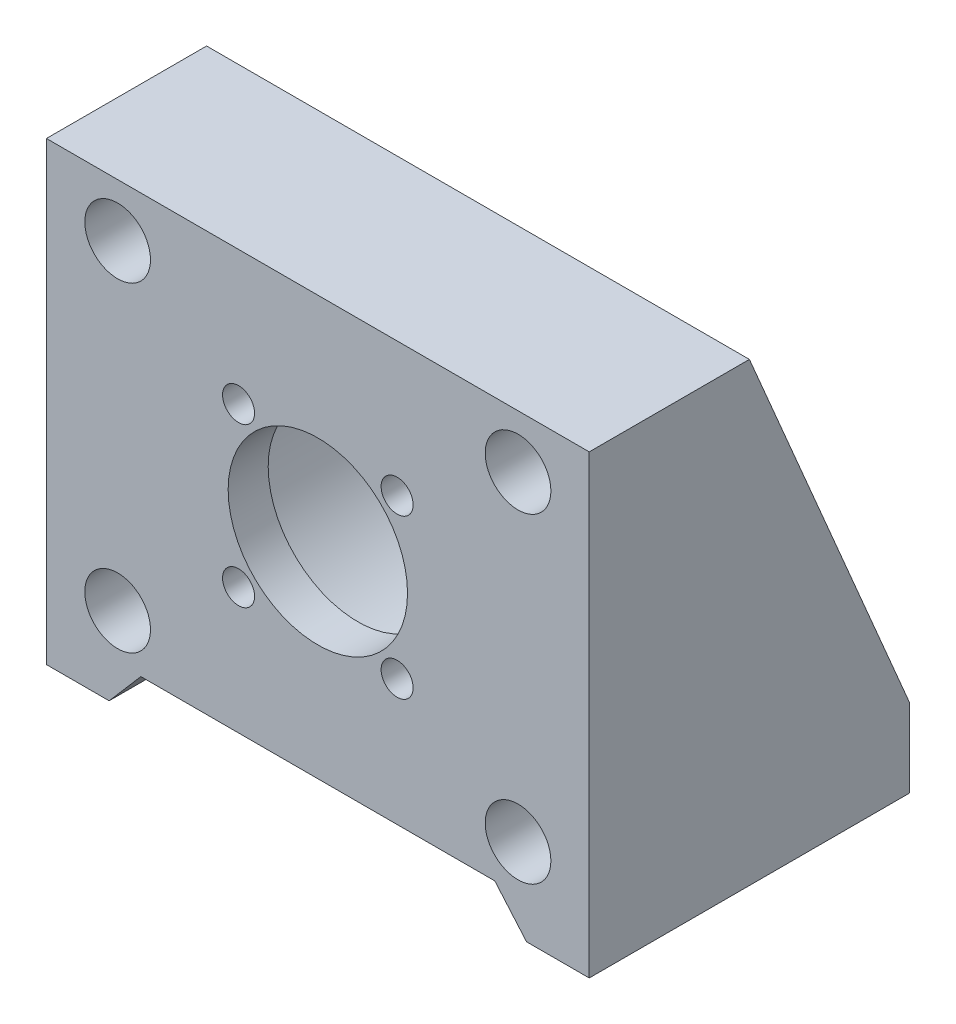
ISO-10303-21;
HEADER;
FILE_DESCRIPTION(('STEP AP214'),'2;1');
FILE_NAME('part.step','',(''),(''),'','','');
FILE_SCHEMA(('AUTOMOTIVE_DESIGN { 1 0 10303 214 1 1 1 1 }'));
ENDSEC;
DATA;
#1=APPLICATION_CONTEXT('core data for automotive mechanical design processes');
#2=APPLICATION_PROTOCOL_DEFINITION('international standard','automotive_design',2000,#1);
#3=PRODUCT_CONTEXT('',#1,'mechanical');
#4=PRODUCT('Part','Part','',(#3));
#5=PRODUCT_RELATED_PRODUCT_CATEGORY('part','',(#4));
#6=PRODUCT_DEFINITION_FORMATION('','',#4);
#7=PRODUCT_DEFINITION_CONTEXT('part definition',#1,'design');
#8=PRODUCT_DEFINITION('design','',#6,#7);
#9=PRODUCT_DEFINITION_SHAPE('','',#8);
#10=(LENGTH_UNIT() NAMED_UNIT(*) SI_UNIT(.MILLI.,.METRE.));
#11=(NAMED_UNIT(*) PLANE_ANGLE_UNIT() SI_UNIT($,.RADIAN.));
#12=(NAMED_UNIT(*) SI_UNIT($,.STERADIAN.) SOLID_ANGLE_UNIT());
#13=UNCERTAINTY_MEASURE_WITH_UNIT(LENGTH_MEASURE(1.E-05),#10,'distance_accuracy_value','');
#14=(GEOMETRIC_REPRESENTATION_CONTEXT(3) GLOBAL_UNCERTAINTY_ASSIGNED_CONTEXT((#13)) GLOBAL_UNIT_ASSIGNED_CONTEXT((#10,
#11,#12)) REPRESENTATION_CONTEXT('',''));
#15=CARTESIAN_POINT('',(0.,0.,0.));
#16=DIRECTION('',(0.,0.,1.));
#17=DIRECTION('',(1.,0.,0.));
#18=AXIS2_PLACEMENT_3D('',#15,#16,#17);
#19=CARTESIAN_POINT('',(0.,0.,5.));
#20=DIRECTION('',(0.,0.,-1.));
#21=DIRECTION('',(-1.,0.,0.));
#22=AXIS2_PLACEMENT_3D('',#19,#20,#21);
#23=PLANE('',#22);
#24=CARTESIAN_POINT('',(25.,-20.,5.));
#25=DIRECTION('',(0.,0.,1.));
#26=DIRECTION('',(1.,0.,0.));
#27=AXIS2_PLACEMENT_3D('',#24,#25,#26);
#28=CIRCLE('',#27,4.10000000000001);
#29=CARTESIAN_POINT('',(29.1,-20.,5.));
#30=VERTEX_POINT('',#29);
#31=EDGE_CURVE('E230',#30,#30,#28,.T.);
#32=ORIENTED_EDGE('',*,*,#31,.F.);
#33=EDGE_LOOP('',(#32));
#34=FACE_BOUND('',#33,.T.);
#35=CARTESIAN_POINT('',(25.,20.,5.));
#36=DIRECTION('',(0.,0.,1.));
#37=DIRECTION('',(1.,0.,0.));
#38=AXIS2_PLACEMENT_3D('',#35,#36,#37);
#39=CIRCLE('',#38,4.10000000000001);
#40=CARTESIAN_POINT('',(29.1,20.,5.));
#41=VERTEX_POINT('',#40);
#42=EDGE_CURVE('E224',#41,#41,#39,.T.);
#43=ORIENTED_EDGE('',*,*,#42,.F.);
#44=EDGE_LOOP('',(#43));
#45=FACE_BOUND('',#44,.T.);
#46=CARTESIAN_POINT('',(-25.,20.,5.));
#47=DIRECTION('',(0.,0.,1.));
#48=DIRECTION('',(1.,0.,0.));
#49=AXIS2_PLACEMENT_3D('',#46,#47,#48);
#50=CIRCLE('',#49,4.10000000000001);
#51=CARTESIAN_POINT('',(-20.9,20.,5.));
#52=VERTEX_POINT('',#51);
#53=EDGE_CURVE('E218',#52,#52,#50,.T.);
#54=ORIENTED_EDGE('',*,*,#53,.F.);
#55=EDGE_LOOP('',(#54));
#56=FACE_BOUND('',#55,.T.);
#57=CARTESIAN_POINT('',(-25.,-20.,5.));
#58=DIRECTION('',(0.,0.,1.));
#59=DIRECTION('',(1.,0.,0.));
#60=AXIS2_PLACEMENT_3D('',#57,#58,#59);
#61=CIRCLE('',#60,4.10000000000001);
#62=CARTESIAN_POINT('',(-20.9,-20.,5.));
#63=VERTEX_POINT('',#62);
#64=EDGE_CURVE('E209',#63,#63,#61,.T.);
#65=ORIENTED_EDGE('',*,*,#64,.F.);
#66=EDGE_LOOP('',(#65));
#67=FACE_BOUND('',#66,.T.);
#68=CARTESIAN_POINT('',(0.,0.,5.));
#69=DIRECTION('',(0.,0.,-1.));
#70=DIRECTION('',(-1.,0.,0.));
#71=AXIS2_PLACEMENT_3D('',#68,#69,#70);
#72=CIRCLE('',#71,11.2);
#73=CARTESIAN_POINT('',(-11.1999999999999,0.,5.));
#74=VERTEX_POINT('',#73);
#75=EDGE_CURVE('E155',#74,#74,#72,.T.);
#76=ORIENTED_EDGE('',*,*,#75,.T.);
#77=EDGE_LOOP('',(#76));
#78=FACE_BOUND('',#77,.T.);
#79=DIRECTION('',(-1.,0.,0.));
#80=VECTOR('',#79,1.);
#81=CARTESIAN_POINT('',(33.8909125624696,26.6303358280027,5.));
#82=LINE('',#81,#80);
#83=CARTESIAN_POINT('',(33.8909125624696,26.6303358280027,5.));
#84=VERTEX_POINT('',#83);
#85=CARTESIAN_POINT('',(-33.8909125624696,26.6303358280027,5.));
#86=VERTEX_POINT('',#85);
#87=EDGE_CURVE('E166',#84,#86,#82,.T.);
#88=ORIENTED_EDGE('',*,*,#87,.T.);
#89=DIRECTION('',(0.,1.,0.));
#90=VECTOR('',#89,1.);
#91=CARTESIAN_POINT('',(-33.8909125624696,-30.2693325558892,5.));
#92=LINE('',#91,#90);
#93=CARTESIAN_POINT('',(-33.8909125624696,-30.2693325558892,5.));
#94=VERTEX_POINT('',#93);
#95=EDGE_CURVE('E133',#94,#86,#92,.T.);
#96=ORIENTED_EDGE('',*,*,#95,.F.);
#97=DIRECTION('',(-1.,0.,0.));
#98=VECTOR('',#97,1.);
#99=CARTESIAN_POINT('',(-26.0623199020207,-30.2693325558892,5.));
#100=LINE('',#99,#98);
#101=CARTESIAN_POINT('',(-26.0623199020207,-30.2693325558892,5.));
#102=VERTEX_POINT('',#101);
#103=EDGE_CURVE('E111',#102,#94,#100,.T.);
#104=ORIENTED_EDGE('',*,*,#103,.F.);
#105=DIRECTION('',(-0.652480888733171,-0.757805179342271,0.));
#106=VECTOR('',#105,1.);
#107=CARTESIAN_POINT('',(-22.0994780457318,-25.6668037531824,5.));
#108=LINE('',#107,#106);
#109=CARTESIAN_POINT('',(-22.0994780457318,-25.6668037531824,5.));
#110=VERTEX_POINT('',#109);
#111=EDGE_CURVE('E136',#110,#102,#108,.T.);
#112=ORIENTED_EDGE('',*,*,#111,.F.);
#113=DIRECTION('',(1.,0.,0.));
#114=VECTOR('',#113,1.);
#115=CARTESIAN_POINT('',(0.,-25.6668037531824,5.));
#116=LINE('',#115,#114);
#117=CARTESIAN_POINT('',(22.0994780457318,-25.6668037531824,5.));
#118=VERTEX_POINT('',#117);
#119=EDGE_CURVE('E158',#110,#118,#116,.T.);
#120=ORIENTED_EDGE('',*,*,#119,.T.);
#121=DIRECTION('',(0.652480888733171,-0.757805179342271,0.));
#122=VECTOR('',#121,1.);
#123=CARTESIAN_POINT('',(22.0994780457318,-25.6668037531824,5.));
#124=LINE('',#123,#122);
#125=CARTESIAN_POINT('',(26.0623199020207,-30.2693325558892,5.));
#126=VERTEX_POINT('',#125);
#127=EDGE_CURVE('E160',#118,#126,#124,.T.);
#128=ORIENTED_EDGE('',*,*,#127,.T.);
#129=DIRECTION('',(1.,0.,0.));
#130=VECTOR('',#129,1.);
#131=CARTESIAN_POINT('',(26.0623199020207,-30.2693325558892,5.));
#132=LINE('',#131,#130);
#133=CARTESIAN_POINT('',(33.8909125624696,-30.2693325558892,5.));
#134=VERTEX_POINT('',#133);
#135=EDGE_CURVE('E162',#126,#134,#132,.T.);
#136=ORIENTED_EDGE('',*,*,#135,.T.);
#137=DIRECTION('',(0.,1.,0.));
#138=VECTOR('',#137,1.);
#139=CARTESIAN_POINT('',(33.8909125624696,-30.2693325558892,5.));
#140=LINE('',#139,#138);
#141=EDGE_CURVE('E164',#134,#84,#140,.T.);
#142=ORIENTED_EDGE('',*,*,#141,.T.);
#143=EDGE_LOOP('',(#88,#96,#104,#112,#120,#128,#136,#142));
#144=FACE_BOUND('',#143,.T.);
#145=CARTESIAN_POINT('',(9.89949493661171,9.89949493661162,5.));
#146=DIRECTION('',(0.,0.,1.));
#147=DIRECTION('',(1.,0.,0.));
#148=AXIS2_PLACEMENT_3D('',#145,#146,#147);
#149=CIRCLE('',#148,2.00000000000001);
#150=CARTESIAN_POINT('',(11.8994949366117,9.89949493661162,5.));
#151=VERTEX_POINT('',#150);
#152=EDGE_CURVE('E236',#151,#151,#149,.T.);
#153=ORIENTED_EDGE('',*,*,#152,.F.);
#154=EDGE_LOOP('',(#153));
#155=FACE_BOUND('',#154,.T.);
#156=CARTESIAN_POINT('',(-9.89949493661165,9.89949493661168,5.));
#157=DIRECTION('',(0.,0.,1.));
#158=DIRECTION('',(1.,0.,0.));
#159=AXIS2_PLACEMENT_3D('',#156,#157,#158);
#160=CIRCLE('',#159,2.00000000000001);
#161=CARTESIAN_POINT('',(-7.89949493661164,9.89949493661168,5.));
#162=VERTEX_POINT('',#161);
#163=EDGE_CURVE('E242',#162,#162,#160,.T.);
#164=ORIENTED_EDGE('',*,*,#163,.F.);
#165=EDGE_LOOP('',(#164));
#166=FACE_BOUND('',#165,.T.);
#167=CARTESIAN_POINT('',(-9.89949493661171,-9.89949493661162,5.));
#168=DIRECTION('',(0.,0.,1.));
#169=DIRECTION('',(1.,0.,0.));
#170=AXIS2_PLACEMENT_3D('',#167,#168,#169);
#171=CIRCLE('',#170,2.00000000000001);
#172=CARTESIAN_POINT('',(-7.8994949366117,-9.89949493661162,5.));
#173=VERTEX_POINT('',#172);
#174=EDGE_CURVE('E248',#173,#173,#171,.T.);
#175=ORIENTED_EDGE('',*,*,#174,.F.);
#176=EDGE_LOOP('',(#175));
#177=FACE_BOUND('',#176,.T.);
#178=CARTESIAN_POINT('',(9.89949493661172,-9.89949493661161,5.));
#179=DIRECTION('',(0.,0.,1.));
#180=DIRECTION('',(1.,0.,0.));
#181=AXIS2_PLACEMENT_3D('',#178,#179,#180);
#182=CIRCLE('',#181,2.00000000000001);
#183=CARTESIAN_POINT('',(11.8994949366117,-9.89949493661161,5.));
#184=VERTEX_POINT('',#183);
#185=EDGE_CURVE('E254',#184,#184,#182,.T.);
#186=ORIENTED_EDGE('',*,*,#185,.F.);
#187=EDGE_LOOP('',(#186));
#188=FACE_BOUND('',#187,.T.);
#189=ADVANCED_FACE('F34',(#34,#45,#56,#67,#78,#144,#155,#166,#177,#188),#23,.F.);
#190=CARTESIAN_POINT('',(0.,0.,5.));
#191=DIRECTION('',(0.,0.,-1.));
#192=DIRECTION('',(-1.,0.,0.));
#193=AXIS2_PLACEMENT_3D('',#190,#191,#192);
#194=CYLINDRICAL_SURFACE('',#193,11.2);
#195=CARTESIAN_POINT('',(0.,0.,0.));
#196=DIRECTION('',(0.,0.,1.));
#197=DIRECTION('',(1.,0.,0.));
#198=AXIS2_PLACEMENT_3D('',#195,#196,#197);
#199=CIRCLE('',#198,11.2);
#200=CARTESIAN_POINT('',(11.2000000000001,0.,0.));
#201=VERTEX_POINT('',#200);
#202=EDGE_CURVE('E124',#201,#201,#199,.F.);
#203=ORIENTED_EDGE('',*,*,#202,.T.);
#204=EDGE_LOOP('',(#203));
#205=FACE_BOUND('',#204,.T.);
#206=ORIENTED_EDGE('',*,*,#75,.F.);
#207=EDGE_LOOP('',(#206));
#208=FACE_BOUND('',#207,.T.);
#209=ADVANCED_FACE('F262',(#205,#208),#194,.F.);
#210=CARTESIAN_POINT('',(0.,-25.6668037531824,5.));
#211=DIRECTION('',(0.,1.,0.));
#212=DIRECTION('',(-1.,0.,0.));
#213=AXIS2_PLACEMENT_3D('',#210,#211,#212);
#214=PLANE('',#213);
#215=ORIENTED_EDGE('',*,*,#119,.F.);
#216=DIRECTION('',(0.,0.,-1.));
#217=VECTOR('',#216,1.);
#218=CARTESIAN_POINT('',(-22.0994780457318,-25.6668037531824,5.));
#219=LINE('',#218,#217);
#220=CARTESIAN_POINT('',(-22.0994780457318,-25.6668037531824,-35.));
#221=VERTEX_POINT('',#220);
#222=EDGE_CURVE('E139',#110,#221,#219,.T.);
#223=ORIENTED_EDGE('',*,*,#222,.T.);
#224=DIRECTION('',(1.,0.,0.));
#225=VECTOR('',#224,1.);
#226=CARTESIAN_POINT('',(0.,-25.6668037531824,-35.));
#227=LINE('',#226,#225);
#228=CARTESIAN_POINT('',(22.0994780457318,-25.6668037531824,-35.));
#229=VERTEX_POINT('',#228);
#230=EDGE_CURVE('E144',#221,#229,#227,.T.);
#231=ORIENTED_EDGE('',*,*,#230,.T.);
#232=DIRECTION('',(0.,0.,-1.));
#233=VECTOR('',#232,1.);
#234=CARTESIAN_POINT('',(22.0994780457318,-25.6668037531824,5.));
#235=LINE('',#234,#233);
#236=EDGE_CURVE('E175',#118,#229,#235,.T.);
#237=ORIENTED_EDGE('',*,*,#236,.F.);
#238=EDGE_LOOP('',(#215,#223,#231,#237));
#239=FACE_BOUND('',#238,.T.);
#240=ADVANCED_FACE('F268',(#239),#214,.F.);
#241=CARTESIAN_POINT('',(22.0994780457318,-25.6668037531824,5.));
#242=DIRECTION('',(0.757805179342271,0.652480888733171,0.));
#243=DIRECTION('',(-0.652480888733171,0.757805179342271,0.));
#244=AXIS2_PLACEMENT_3D('',#241,#242,#243);
#245=PLANE('',#244);
#246=ORIENTED_EDGE('',*,*,#236,.T.);
#247=DIRECTION('',(0.652480888733171,-0.757805179342271,0.));
#248=VECTOR('',#247,1.);
#249=CARTESIAN_POINT('',(22.0994780457318,-25.6668037531824,-35.));
#250=LINE('',#249,#248);
#251=CARTESIAN_POINT('',(26.0623199020207,-30.2693325558892,-35.));
#252=VERTEX_POINT('',#251);
#253=EDGE_CURVE('E147',#229,#252,#250,.T.);
#254=ORIENTED_EDGE('',*,*,#253,.T.);
#255=DIRECTION('',(0.,0.,-1.));
#256=VECTOR('',#255,1.);
#257=CARTESIAN_POINT('',(26.0623199020207,-30.2693325558892,5.));
#258=LINE('',#257,#256);
#259=EDGE_CURVE('E173',#126,#252,#258,.T.);
#260=ORIENTED_EDGE('',*,*,#259,.F.);
#261=ORIENTED_EDGE('',*,*,#127,.F.);
#262=EDGE_LOOP('',(#246,#254,#260,#261));
#263=FACE_BOUND('',#262,.T.);
#264=ADVANCED_FACE('F282',(#263),#245,.F.);
#265=CARTESIAN_POINT('',(26.0623199020207,-30.2693325558892,5.));
#266=DIRECTION('',(0.,1.,0.));
#267=DIRECTION('',(0.,0.,1.));
#268=AXIS2_PLACEMENT_3D('',#265,#266,#267);
#269=PLANE('',#268);
#270=ORIENTED_EDGE('',*,*,#259,.T.);
#271=DIRECTION('',(1.,0.,0.));
#272=VECTOR('',#271,1.);
#273=CARTESIAN_POINT('',(26.0623199020207,-30.2693325558892,-35.));
#274=LINE('',#273,#272);
#275=CARTESIAN_POINT('',(33.8909125624696,-30.2693325558892,-35.));
#276=VERTEX_POINT('',#275);
#277=EDGE_CURVE('E150',#252,#276,#274,.T.);
#278=ORIENTED_EDGE('',*,*,#277,.T.);
#279=DIRECTION('',(0.,0.,-1.));
#280=VECTOR('',#279,1.);
#281=CARTESIAN_POINT('',(33.8909125624696,-30.2693325558892,5.));
#282=LINE('',#281,#280);
#283=EDGE_CURVE('E171',#134,#276,#282,.T.);
#284=ORIENTED_EDGE('',*,*,#283,.F.);
#285=ORIENTED_EDGE('',*,*,#135,.F.);
#286=EDGE_LOOP('',(#270,#278,#284,#285));
#287=FACE_BOUND('',#286,.T.);
#288=ADVANCED_FACE('F279',(#287),#269,.F.);
#289=CARTESIAN_POINT('',(33.8909125624696,-30.2693325558892,5.));
#290=DIRECTION('',(-1.,0.,0.));
#291=DIRECTION('',(0.,0.,1.));
#292=AXIS2_PLACEMENT_3D('',#289,#290,#291);
#293=PLANE('',#292);
#294=DIRECTION('',(0.,1.,0.));
#295=VECTOR('',#294,1.);
#296=CARTESIAN_POINT('',(33.8909125624696,-30.2693325558892,-35.));
#297=LINE('',#296,#295);
#298=CARTESIAN_POINT('',(33.8909125624696,-20.4867114884723,-35.));
#299=VERTEX_POINT('',#298);
#300=EDGE_CURVE('E153',#276,#299,#297,.T.);
#301=ORIENTED_EDGE('',*,*,#300,.T.);
#302=DIRECTION('',(0.,0.92050485345244,0.390731128489275));
#303=VECTOR('',#302,1.);
#304=CARTESIAN_POINT('',(33.8909125624696,26.6303358280027,-15.));
#305=LINE('',#304,#303);
#306=CARTESIAN_POINT('',(33.8909125624696,26.6303358280027,-15.));
#307=VERTEX_POINT('',#306);
#308=EDGE_CURVE('E11',#299,#307,#305,.T.);
#309=ORIENTED_EDGE('',*,*,#308,.T.);
#310=DIRECTION('',(0.,0.,-1.));
#311=VECTOR('',#310,1.);
#312=CARTESIAN_POINT('',(33.8909125624696,26.6303358280027,5.));
#313=LINE('',#312,#311);
#314=EDGE_CURVE('E168',#84,#307,#313,.T.);
#315=ORIENTED_EDGE('',*,*,#314,.F.);
#316=ORIENTED_EDGE('',*,*,#141,.F.);
#317=ORIENTED_EDGE('',*,*,#283,.T.);
#318=EDGE_LOOP('',(#301,#309,#315,#316,#317));
#319=FACE_BOUND('',#318,.T.);
#320=ADVANCED_FACE('F196',(#319),#293,.F.);
#321=CARTESIAN_POINT('',(33.8909125624696,26.6303358280027,5.));
#322=DIRECTION('',(0.,-1.,0.));
#323=DIRECTION('',(1.,0.,0.));
#324=AXIS2_PLACEMENT_3D('',#321,#322,#323);
#325=PLANE('',#324);
#326=ORIENTED_EDGE('',*,*,#314,.T.);
#327=DIRECTION('',(-1.,0.,0.));
#328=VECTOR('',#327,1.);
#329=CARTESIAN_POINT('',(-33.8909125624696,26.6303358280027,-15.));
#330=LINE('',#329,#328);
#331=CARTESIAN_POINT('',(-33.8909125624696,26.6303358280027,-15.));
#332=VERTEX_POINT('',#331);
#333=EDGE_CURVE('E176',#307,#332,#330,.T.);
#334=ORIENTED_EDGE('',*,*,#333,.T.);
#335=DIRECTION('',(0.,0.,-1.));
#336=VECTOR('',#335,1.);
#337=CARTESIAN_POINT('',(-33.8909125624696,26.6303358280027,5.));
#338=LINE('',#337,#336);
#339=EDGE_CURVE('E114',#86,#332,#338,.T.);
#340=ORIENTED_EDGE('',*,*,#339,.F.);
#341=ORIENTED_EDGE('',*,*,#87,.F.);
#342=EDGE_LOOP('',(#326,#334,#340,#341));
#343=FACE_BOUND('',#342,.T.);
#344=ADVANCED_FACE('F184',(#343),#325,.F.);
#345=CARTESIAN_POINT('',(0.,0.,-35.));
#346=DIRECTION('',(0.,0.,-1.));
#347=DIRECTION('',(-1.,0.,0.));
#348=AXIS2_PLACEMENT_3D('',#345,#346,#347);
#349=PLANE('',#348);
#350=DIRECTION('',(0.,1.,0.));
#351=VECTOR('',#350,1.);
#352=CARTESIAN_POINT('',(-33.8909125624696,-30.2693325558892,-35.));
#353=LINE('',#352,#351);
#354=CARTESIAN_POINT('',(-33.8909125624696,-30.2693325558892,-35.));
#355=VERTEX_POINT('',#354);
#356=CARTESIAN_POINT('',(-33.8909125624696,-20.4867114884723,-35.));
#357=VERTEX_POINT('',#356);
#358=EDGE_CURVE('E119',#355,#357,#353,.T.);
#359=ORIENTED_EDGE('',*,*,#358,.T.);
#360=DIRECTION('',(1.,0.,0.));
#361=VECTOR('',#360,1.);
#362=CARTESIAN_POINT('',(33.8909125624696,-20.4867114884723,-35.));
#363=LINE('',#362,#361);
#364=EDGE_CURVE('E43',#357,#299,#363,.T.);
#365=ORIENTED_EDGE('',*,*,#364,.T.);
#366=ORIENTED_EDGE('',*,*,#300,.F.);
#367=ORIENTED_EDGE('',*,*,#277,.F.);
#368=ORIENTED_EDGE('',*,*,#253,.F.);
#369=ORIENTED_EDGE('',*,*,#230,.F.);
#370=DIRECTION('',(-0.652480888733171,-0.757805179342271,0.));
#371=VECTOR('',#370,1.);
#372=CARTESIAN_POINT('',(-22.0994780457318,-25.6668037531824,-35.));
#373=LINE('',#372,#371);
#374=CARTESIAN_POINT('',(-26.0623199020207,-30.2693325558892,-35.));
#375=VERTEX_POINT('',#374);
#376=EDGE_CURVE('E121',#221,#375,#373,.T.);
#377=ORIENTED_EDGE('',*,*,#376,.T.);
#378=DIRECTION('',(-1.,0.,0.));
#379=VECTOR('',#378,1.);
#380=CARTESIAN_POINT('',(-26.0623199020207,-30.2693325558892,-35.));
#381=LINE('',#380,#379);
#382=EDGE_CURVE('E109',#375,#355,#381,.T.);
#383=ORIENTED_EDGE('',*,*,#382,.T.);
#384=EDGE_LOOP('',(#359,#365,#366,#367,#368,#369,#377,#383));
#385=FACE_BOUND('',#384,.T.);
#386=ADVANCED_FACE('F118',(#385),#349,.T.);
#387=CARTESIAN_POINT('',(-33.8909125624696,-30.2693325558892,5.));
#388=DIRECTION('',(-1.,0.,0.));
#389=DIRECTION('',(0.,0.,1.));
#390=AXIS2_PLACEMENT_3D('',#387,#388,#389);
#391=PLANE('',#390);
#392=ORIENTED_EDGE('',*,*,#339,.T.);
#393=DIRECTION('',(0.,-0.92050485345244,-0.390731128489275));
#394=VECTOR('',#393,1.);
#395=CARTESIAN_POINT('',(-33.8909125624696,-14.3890158201625,-32.4116817518921));
#396=LINE('',#395,#394);
#397=EDGE_CURVE('E57',#332,#357,#396,.T.);
#398=ORIENTED_EDGE('',*,*,#397,.T.);
#399=ORIENTED_EDGE('',*,*,#358,.F.);
#400=DIRECTION('',(0.,0.,-1.));
#401=VECTOR('',#400,1.);
#402=CARTESIAN_POINT('',(-33.8909125624696,-30.2693325558892,5.));
#403=LINE('',#402,#401);
#404=EDGE_CURVE('E106',#94,#355,#403,.T.);
#405=ORIENTED_EDGE('',*,*,#404,.F.);
#406=ORIENTED_EDGE('',*,*,#95,.T.);
#407=EDGE_LOOP('',(#392,#398,#399,#405,#406));
#408=FACE_BOUND('',#407,.T.);
#409=ADVANCED_FACE('F123',(#408),#391,.T.);
#410=CARTESIAN_POINT('',(-26.0623199020207,-30.2693325558892,5.));
#411=DIRECTION('',(0.,-1.,0.));
#412=DIRECTION('',(0.,0.,-1.));
#413=AXIS2_PLACEMENT_3D('',#410,#411,#412);
#414=PLANE('',#413);
#415=ORIENTED_EDGE('',*,*,#404,.T.);
#416=ORIENTED_EDGE('',*,*,#382,.F.);
#417=DIRECTION('',(0.,0.,-1.));
#418=VECTOR('',#417,1.);
#419=CARTESIAN_POINT('',(-26.0623199020207,-30.2693325558892,5.));
#420=LINE('',#419,#418);
#421=EDGE_CURVE('E115',#102,#375,#420,.T.);
#422=ORIENTED_EDGE('',*,*,#421,.F.);
#423=ORIENTED_EDGE('',*,*,#103,.T.);
#424=EDGE_LOOP('',(#415,#416,#422,#423));
#425=FACE_BOUND('',#424,.T.);
#426=ADVANCED_FACE('F108',(#425),#414,.T.);
#427=CARTESIAN_POINT('',(-22.0994780457318,-25.6668037531824,5.));
#428=DIRECTION('',(0.757805179342271,-0.652480888733171,0.));
#429=DIRECTION('',(0.652480888733171,0.757805179342271,0.));
#430=AXIS2_PLACEMENT_3D('',#427,#428,#429);
#431=PLANE('',#430);
#432=ORIENTED_EDGE('',*,*,#421,.T.);
#433=ORIENTED_EDGE('',*,*,#376,.F.);
#434=ORIENTED_EDGE('',*,*,#222,.F.);
#435=ORIENTED_EDGE('',*,*,#111,.T.);
#436=EDGE_LOOP('',(#432,#433,#434,#435));
#437=FACE_BOUND('',#436,.T.);
#438=ADVANCED_FACE('F295',(#437),#431,.T.);
#439=CARTESIAN_POINT('',(0.,0.,0.));
#440=DIRECTION('',(0.,0.,1.));
#441=DIRECTION('',(1.,0.,0.));
#442=AXIS2_PLACEMENT_3D('',#439,#440,#441);
#443=PLANE('',#442);
#444=CARTESIAN_POINT('',(9.89949493661172,-9.89949493661161,0.));
#445=DIRECTION('',(0.,0.,1.));
#446=DIRECTION('',(1.,0.,0.));
#447=AXIS2_PLACEMENT_3D('',#444,#445,#446);
#448=CIRCLE('',#447,2.00000000000001);
#449=CARTESIAN_POINT('',(11.8994949366117,-9.89949493661161,0.));
#450=VERTEX_POINT('',#449);
#451=EDGE_CURVE('E251',#450,#450,#448,.T.);
#452=ORIENTED_EDGE('',*,*,#451,.T.);
#453=EDGE_LOOP('',(#452));
#454=FACE_BOUND('',#453,.T.);
#455=CARTESIAN_POINT('',(-9.89949493661171,-9.89949493661162,0.));
#456=DIRECTION('',(0.,0.,1.));
#457=DIRECTION('',(1.,0.,0.));
#458=AXIS2_PLACEMENT_3D('',#455,#456,#457);
#459=CIRCLE('',#458,2.00000000000001);
#460=CARTESIAN_POINT('',(-7.8994949366117,-9.89949493661162,0.));
#461=VERTEX_POINT('',#460);
#462=EDGE_CURVE('E245',#461,#461,#459,.T.);
#463=ORIENTED_EDGE('',*,*,#462,.T.);
#464=EDGE_LOOP('',(#463));
#465=FACE_BOUND('',#464,.T.);
#466=CARTESIAN_POINT('',(-9.89949493661165,9.89949493661168,0.));
#467=DIRECTION('',(0.,0.,1.));
#468=DIRECTION('',(1.,0.,0.));
#469=AXIS2_PLACEMENT_3D('',#466,#467,#468);
#470=CIRCLE('',#469,2.00000000000001);
#471=CARTESIAN_POINT('',(-7.89949493661164,9.89949493661168,0.));
#472=VERTEX_POINT('',#471);
#473=EDGE_CURVE('E239',#472,#472,#470,.T.);
#474=ORIENTED_EDGE('',*,*,#473,.T.);
#475=EDGE_LOOP('',(#474));
#476=FACE_BOUND('',#475,.T.);
#477=CARTESIAN_POINT('',(9.89949493661171,9.89949493661162,0.));
#478=DIRECTION('',(0.,0.,1.));
#479=DIRECTION('',(1.,0.,0.));
#480=AXIS2_PLACEMENT_3D('',#477,#478,#479);
#481=CIRCLE('',#480,2.00000000000001);
#482=CARTESIAN_POINT('',(11.8994949366117,9.89949493661162,0.));
#483=VERTEX_POINT('',#482);
#484=EDGE_CURVE('E233',#483,#483,#481,.T.);
#485=ORIENTED_EDGE('',*,*,#484,.T.);
#486=EDGE_LOOP('',(#485));
#487=FACE_BOUND('',#486,.T.);
#488=CARTESIAN_POINT('',(0.,0.,0.));
#489=DIRECTION('',(0.,0.,1.));
#490=DIRECTION('',(1.,0.,0.));
#491=AXIS2_PLACEMENT_3D('',#488,#489,#490);
#492=CIRCLE('',#491,18.1);
#493=CARTESIAN_POINT('',(18.1,0.,0.));
#494=VERTEX_POINT('',#493);
#495=EDGE_CURVE('E129',#494,#494,#492,.T.);
#496=ORIENTED_EDGE('',*,*,#495,.F.);
#497=EDGE_LOOP('',(#496));
#498=FACE_BOUND('',#497,.T.);
#499=ORIENTED_EDGE('',*,*,#202,.F.);
#500=EDGE_LOOP('',(#499));
#501=FACE_BOUND('',#500,.T.);
#502=ADVANCED_FACE('F297',(#454,#465,#476,#487,#498,#501),#443,.F.);
#503=CARTESIAN_POINT('',(0.,0.,-35.));
#504=DIRECTION('',(0.,0.,1.));
#505=DIRECTION('',(1.,0.,0.));
#506=AXIS2_PLACEMENT_3D('',#503,#504,#505);
#507=CYLINDRICAL_SURFACE('',#506,18.1);
#508=CARTESIAN_POINT('',(0.,0.,-26.3039069061915));
#509=DIRECTION('',(0.,0.390731128489275,-0.92050485345244));
#510=DIRECTION('',(0.,0.92050485345244,0.390731128489275));
#511=AXIS2_PLACEMENT_3D('',#508,#509,#510);
#512=ELLIPSE('',#511,19.6631228310359,18.1);
#513=CARTESIAN_POINT('',(0.,18.1,-18.6209127327976));
#514=VERTEX_POINT('',#513);
#515=EDGE_CURVE('E38',#514,#514,#512,.F.);
#516=ORIENTED_EDGE('',*,*,#515,.F.);
#517=EDGE_LOOP('',(#516));
#518=FACE_BOUND('',#517,.T.);
#519=ORIENTED_EDGE('',*,*,#495,.T.);
#520=EDGE_LOOP('',(#519));
#521=FACE_BOUND('',#520,.T.);
#522=ADVANCED_FACE('F200',(#518,#521),#507,.F.);
#523=CARTESIAN_POINT('',(33.8909125624696,26.6303358280027,-15.));
#524=DIRECTION('',(0.,0.390731128489275,-0.92050485345244));
#525=DIRECTION('',(1.,0.,0.));
#526=AXIS2_PLACEMENT_3D('',#523,#524,#525);
#527=PLANE('',#526);
#528=ORIENTED_EDGE('',*,*,#308,.F.);
#529=ORIENTED_EDGE('',*,*,#364,.F.);
#530=ORIENTED_EDGE('',*,*,#397,.F.);
#531=ORIENTED_EDGE('',*,*,#333,.F.);
#532=EDGE_LOOP('',(#528,#529,#530,#531));
#533=FACE_BOUND('',#532,.T.);
#534=ORIENTED_EDGE('',*,*,#515,.T.);
#535=EDGE_LOOP('',(#534));
#536=FACE_BOUND('',#535,.T.);
#537=ADVANCED_FACE('F36',(#533,#536),#527,.T.);
#538=CARTESIAN_POINT('',(-25.,-20.,-10.));
#539=DIRECTION('',(0.,0.,-1.));
#540=DIRECTION('',(-1.,0.,0.));
#541=AXIS2_PLACEMENT_3D('',#538,#539,#540);
#542=PLANE('',#541);
#543=CARTESIAN_POINT('',(-25.,-20.,-10.));
#544=DIRECTION('',(0.,0.,1.));
#545=DIRECTION('',(1.,0.,0.));
#546=AXIS2_PLACEMENT_3D('',#543,#544,#545);
#547=CIRCLE('',#546,4.10000000000001);
#548=CARTESIAN_POINT('',(-20.9,-20.,-10.));
#549=VERTEX_POINT('',#548);
#550=EDGE_CURVE('E205',#549,#549,#547,.T.);
#551=ORIENTED_EDGE('',*,*,#550,.T.);
#552=EDGE_LOOP('',(#551));
#553=FACE_BOUND('',#552,.T.);
#554=ADVANCED_FACE('F199',(#553),#542,.F.);
#555=CARTESIAN_POINT('',(-25.,-20.,5.));
#556=DIRECTION('',(0.,0.,1.));
#557=DIRECTION('',(1.,0.,0.));
#558=AXIS2_PLACEMENT_3D('',#555,#556,#557);
#559=CYLINDRICAL_SURFACE('',#558,4.10000000000001);
#560=ORIENTED_EDGE('',*,*,#550,.F.);
#561=EDGE_LOOP('',(#560));
#562=FACE_BOUND('',#561,.T.);
#563=ORIENTED_EDGE('',*,*,#64,.T.);
#564=EDGE_LOOP('',(#563));
#565=FACE_BOUND('',#564,.T.);
#566=ADVANCED_FACE('F396',(#562,#565),#559,.F.);
#567=CARTESIAN_POINT('',(-25.,20.,-10.));
#568=DIRECTION('',(0.,0.,-1.));
#569=DIRECTION('',(-1.,0.,0.));
#570=AXIS2_PLACEMENT_3D('',#567,#568,#569);
#571=PLANE('',#570);
#572=CARTESIAN_POINT('',(-25.,20.,-10.));
#573=DIRECTION('',(0.,0.,1.));
#574=DIRECTION('',(1.,0.,0.));
#575=AXIS2_PLACEMENT_3D('',#572,#573,#574);
#576=CIRCLE('',#575,4.10000000000001);
#577=CARTESIAN_POINT('',(-20.9,20.,-10.));
#578=VERTEX_POINT('',#577);
#579=EDGE_CURVE('E213',#578,#578,#576,.T.);
#580=ORIENTED_EDGE('',*,*,#579,.T.);
#581=EDGE_LOOP('',(#580));
#582=FACE_BOUND('',#581,.T.);
#583=ADVANCED_FACE('F404',(#582),#571,.F.);
#584=CARTESIAN_POINT('',(-25.,20.,5.));
#585=DIRECTION('',(0.,0.,1.));
#586=DIRECTION('',(1.,0.,0.));
#587=AXIS2_PLACEMENT_3D('',#584,#585,#586);
#588=CYLINDRICAL_SURFACE('',#587,4.10000000000001);
#589=ORIENTED_EDGE('',*,*,#579,.F.);
#590=EDGE_LOOP('',(#589));
#591=FACE_BOUND('',#590,.T.);
#592=ORIENTED_EDGE('',*,*,#53,.T.);
#593=EDGE_LOOP('',(#592));
#594=FACE_BOUND('',#593,.T.);
#595=ADVANCED_FACE('F413',(#591,#594),#588,.F.);
#596=CARTESIAN_POINT('',(25.,20.,-10.));
#597=DIRECTION('',(0.,0.,-1.));
#598=DIRECTION('',(-1.,0.,0.));
#599=AXIS2_PLACEMENT_3D('',#596,#597,#598);
#600=PLANE('',#599);
#601=CARTESIAN_POINT('',(25.,20.,-10.));
#602=DIRECTION('',(0.,0.,1.));
#603=DIRECTION('',(1.,0.,0.));
#604=AXIS2_PLACEMENT_3D('',#601,#602,#603);
#605=CIRCLE('',#604,4.10000000000001);
#606=CARTESIAN_POINT('',(29.1,20.,-10.));
#607=VERTEX_POINT('',#606);
#608=EDGE_CURVE('E221',#607,#607,#605,.T.);
#609=ORIENTED_EDGE('',*,*,#608,.T.);
#610=EDGE_LOOP('',(#609));
#611=FACE_BOUND('',#610,.T.);
#612=ADVANCED_FACE('F422',(#611),#600,.F.);
#613=CARTESIAN_POINT('',(25.,20.,5.));
#614=DIRECTION('',(0.,0.,1.));
#615=DIRECTION('',(1.,0.,0.));
#616=AXIS2_PLACEMENT_3D('',#613,#614,#615);
#617=CYLINDRICAL_SURFACE('',#616,4.10000000000001);
#618=ORIENTED_EDGE('',*,*,#608,.F.);
#619=EDGE_LOOP('',(#618));
#620=FACE_BOUND('',#619,.T.);
#621=ORIENTED_EDGE('',*,*,#42,.T.);
#622=EDGE_LOOP('',(#621));
#623=FACE_BOUND('',#622,.T.);
#624=ADVANCED_FACE('F431',(#620,#623),#617,.F.);
#625=CARTESIAN_POINT('',(25.,-20.,-10.));
#626=DIRECTION('',(0.,0.,-1.));
#627=DIRECTION('',(-1.,0.,0.));
#628=AXIS2_PLACEMENT_3D('',#625,#626,#627);
#629=PLANE('',#628);
#630=CARTESIAN_POINT('',(25.,-20.,-10.));
#631=DIRECTION('',(0.,0.,1.));
#632=DIRECTION('',(1.,0.,0.));
#633=AXIS2_PLACEMENT_3D('',#630,#631,#632);
#634=CIRCLE('',#633,4.10000000000001);
#635=CARTESIAN_POINT('',(29.1,-20.,-10.));
#636=VERTEX_POINT('',#635);
#637=EDGE_CURVE('E227',#636,#636,#634,.T.);
#638=ORIENTED_EDGE('',*,*,#637,.T.);
#639=EDGE_LOOP('',(#638));
#640=FACE_BOUND('',#639,.T.);
#641=ADVANCED_FACE('F440',(#640),#629,.F.);
#642=CARTESIAN_POINT('',(25.,-20.,5.));
#643=DIRECTION('',(0.,0.,1.));
#644=DIRECTION('',(1.,0.,0.));
#645=AXIS2_PLACEMENT_3D('',#642,#643,#644);
#646=CYLINDRICAL_SURFACE('',#645,4.10000000000001);
#647=ORIENTED_EDGE('',*,*,#637,.F.);
#648=EDGE_LOOP('',(#647));
#649=FACE_BOUND('',#648,.T.);
#650=ORIENTED_EDGE('',*,*,#31,.T.);
#651=EDGE_LOOP('',(#650));
#652=FACE_BOUND('',#651,.T.);
#653=ADVANCED_FACE('F449',(#649,#652),#646,.F.);
#654=CARTESIAN_POINT('',(9.89949493661171,9.89949493661162,5.));
#655=DIRECTION('',(0.,0.,1.));
#656=DIRECTION('',(1.,0.,0.));
#657=AXIS2_PLACEMENT_3D('',#654,#655,#656);
#658=CYLINDRICAL_SURFACE('',#657,2.00000000000001);
#659=ORIENTED_EDGE('',*,*,#152,.T.);
#660=EDGE_LOOP('',(#659));
#661=FACE_BOUND('',#660,.T.);
#662=ORIENTED_EDGE('',*,*,#484,.F.);
#663=EDGE_LOOP('',(#662));
#664=FACE_BOUND('',#663,.T.);
#665=ADVANCED_FACE('F458',(#661,#664),#658,.F.);
#666=CARTESIAN_POINT('',(-9.89949493661165,9.89949493661168,5.));
#667=DIRECTION('',(0.,0.,1.));
#668=DIRECTION('',(1.,0.,0.));
#669=AXIS2_PLACEMENT_3D('',#666,#667,#668);
#670=CYLINDRICAL_SURFACE('',#669,2.00000000000001);
#671=ORIENTED_EDGE('',*,*,#163,.T.);
#672=EDGE_LOOP('',(#671));
#673=FACE_BOUND('',#672,.T.);
#674=ORIENTED_EDGE('',*,*,#473,.F.);
#675=EDGE_LOOP('',(#674));
#676=FACE_BOUND('',#675,.T.);
#677=ADVANCED_FACE('F467',(#673,#676),#670,.F.);
#678=CARTESIAN_POINT('',(-9.89949493661171,-9.89949493661162,5.));
#679=DIRECTION('',(0.,0.,1.));
#680=DIRECTION('',(1.,0.,0.));
#681=AXIS2_PLACEMENT_3D('',#678,#679,#680);
#682=CYLINDRICAL_SURFACE('',#681,2.00000000000001);
#683=ORIENTED_EDGE('',*,*,#174,.T.);
#684=EDGE_LOOP('',(#683));
#685=FACE_BOUND('',#684,.T.);
#686=ORIENTED_EDGE('',*,*,#462,.F.);
#687=EDGE_LOOP('',(#686));
#688=FACE_BOUND('',#687,.T.);
#689=ADVANCED_FACE('F482',(#685,#688),#682,.F.);
#690=CARTESIAN_POINT('',(9.89949493661172,-9.89949493661161,5.));
#691=DIRECTION('',(0.,0.,1.));
#692=DIRECTION('',(1.,0.,0.));
#693=AXIS2_PLACEMENT_3D('',#690,#691,#692);
#694=CYLINDRICAL_SURFACE('',#693,2.00000000000001);
#695=ORIENTED_EDGE('',*,*,#185,.T.);
#696=EDGE_LOOP('',(#695));
#697=FACE_BOUND('',#696,.T.);
#698=ORIENTED_EDGE('',*,*,#451,.F.);
#699=EDGE_LOOP('',(#698));
#700=FACE_BOUND('',#699,.T.);
#701=ADVANCED_FACE('F258',(#697,#700),#694,.F.);
#702=CLOSED_SHELL('',(#189,#209,#240,#264,#288,#320,#344,#386,#409,#426,#438,#502,#522,#537,
#554,#566,#583,#595,#612,#624,#641,#653,#665,#677,#689,#701));
#703=MANIFOLD_SOLID_BREP('B2',#702);
#704=ADVANCED_BREP_SHAPE_REPRESENTATION('',(#18,#703),#14);
#705=SHAPE_DEFINITION_REPRESENTATION(#9,#704);
ENDSEC;
END-ISO-10303-21;
